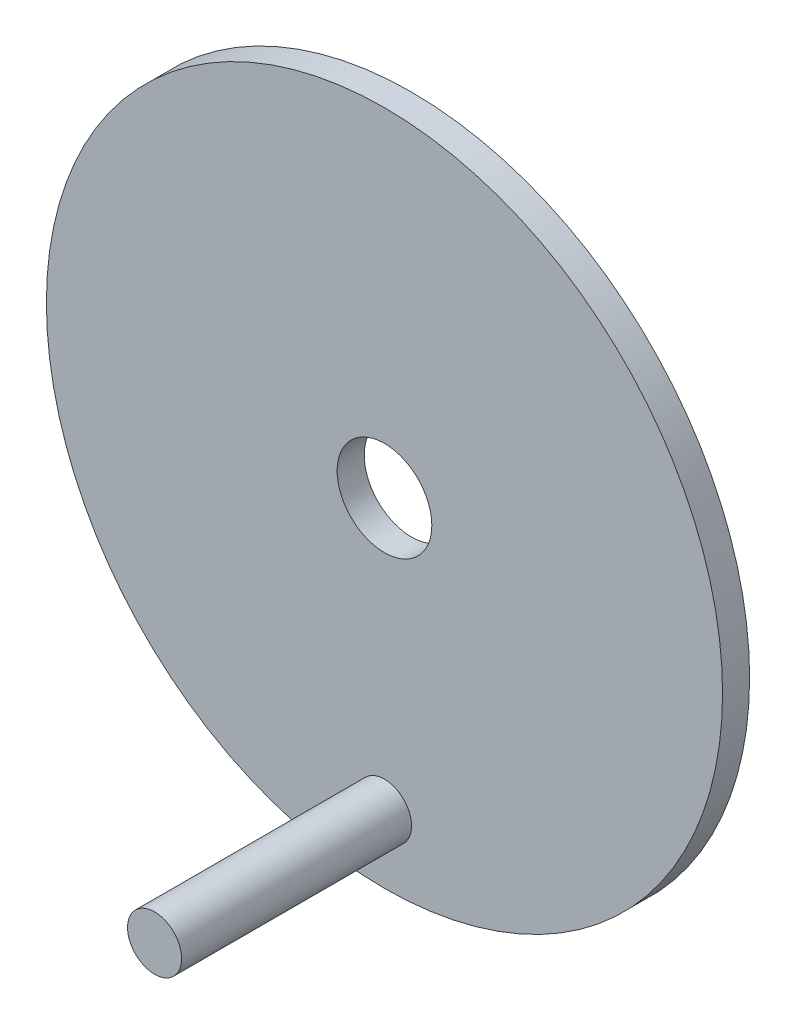
ISO-10303-21;
HEADER;
FILE_DESCRIPTION(('STEP AP214'),'2;1');
FILE_NAME('part.step','',(''),(''),'','','');
FILE_SCHEMA(('AUTOMOTIVE_DESIGN { 1 0 10303 214 1 1 1 1 }'));
ENDSEC;
DATA;
#1=APPLICATION_CONTEXT('core data for automotive mechanical design processes');
#2=APPLICATION_PROTOCOL_DEFINITION('international standard','automotive_design',2000,#1);
#3=PRODUCT_CONTEXT('',#1,'mechanical');
#4=PRODUCT('Part','Part','',(#3));
#5=PRODUCT_RELATED_PRODUCT_CATEGORY('part','',(#4));
#6=PRODUCT_DEFINITION_FORMATION('','',#4);
#7=PRODUCT_DEFINITION_CONTEXT('part definition',#1,'design');
#8=PRODUCT_DEFINITION('design','',#6,#7);
#9=PRODUCT_DEFINITION_SHAPE('','',#8);
#10=(LENGTH_UNIT() NAMED_UNIT(*) SI_UNIT(.MILLI.,.METRE.));
#11=(NAMED_UNIT(*) PLANE_ANGLE_UNIT() SI_UNIT($,.RADIAN.));
#12=(NAMED_UNIT(*) SI_UNIT($,.STERADIAN.) SOLID_ANGLE_UNIT());
#13=UNCERTAINTY_MEASURE_WITH_UNIT(LENGTH_MEASURE(1.E-05),#10,'distance_accuracy_value','');
#14=(GEOMETRIC_REPRESENTATION_CONTEXT(3) GLOBAL_UNCERTAINTY_ASSIGNED_CONTEXT((#13)) GLOBAL_UNIT_ASSIGNED_CONTEXT((#10,
#11,#12)) REPRESENTATION_CONTEXT('',''));
#15=CARTESIAN_POINT('',(0.,0.,0.));
#16=DIRECTION('',(0.,0.,1.));
#17=DIRECTION('',(1.,0.,0.));
#18=AXIS2_PLACEMENT_3D('',#15,#16,#17);
#19=CARTESIAN_POINT('',(0.,0.,20.));
#20=DIRECTION('',(0.,0.,1.));
#21=DIRECTION('',(1.,0.,0.));
#22=AXIS2_PLACEMENT_3D('',#19,#20,#21);
#23=PLANE('',#22);
#24=CARTESIAN_POINT('',(0.,-200.,20.));
#25=DIRECTION('',(0.,0.,1.));
#26=DIRECTION('',(1.,0.,0.));
#27=AXIS2_PLACEMENT_3D('',#24,#25,#26);
#28=CIRCLE('',#27,20.);
#29=CARTESIAN_POINT('',(20.,-200.,20.));
#30=VERTEX_POINT('',#29);
#31=EDGE_CURVE('E49',#30,#30,#28,.T.);
#32=ORIENTED_EDGE('',*,*,#31,.F.);
#33=EDGE_LOOP('',(#32));
#34=FACE_BOUND('',#33,.T.);
#35=CARTESIAN_POINT('',(0.,0.,20.));
#36=DIRECTION('',(0.,0.,1.));
#37=DIRECTION('',(1.,0.,0.));
#38=AXIS2_PLACEMENT_3D('',#35,#36,#37);
#39=CIRCLE('',#38,250.);
#40=CARTESIAN_POINT('',(250.,0.,20.));
#41=VERTEX_POINT('',#40);
#42=EDGE_CURVE('E10',#41,#41,#39,.T.);
#43=ORIENTED_EDGE('',*,*,#42,.T.);
#44=EDGE_LOOP('',(#43));
#45=FACE_BOUND('',#44,.T.);
#46=CARTESIAN_POINT('',(0.,0.,20.));
#47=DIRECTION('',(0.,0.,1.));
#48=DIRECTION('',(1.,0.,0.));
#49=AXIS2_PLACEMENT_3D('',#46,#47,#48);
#50=CIRCLE('',#49,35.);
#51=CARTESIAN_POINT('',(35.,0.,20.));
#52=VERTEX_POINT('',#51);
#53=EDGE_CURVE('E41',#52,#52,#50,.T.);
#54=ORIENTED_EDGE('',*,*,#53,.F.);
#55=EDGE_LOOP('',(#54));
#56=FACE_BOUND('',#55,.T.);
#57=ADVANCED_FACE('F30',(#34,#45,#56),#23,.T.);
#58=CARTESIAN_POINT('',(0.,0.,0.));
#59=DIRECTION('',(0.,0.,1.));
#60=DIRECTION('',(1.,0.,0.));
#61=AXIS2_PLACEMENT_3D('',#58,#59,#60);
#62=PLANE('',#61);
#63=CARTESIAN_POINT('',(0.,0.,0.));
#64=DIRECTION('',(0.,0.,1.));
#65=DIRECTION('',(1.,0.,0.));
#66=AXIS2_PLACEMENT_3D('',#63,#64,#65);
#67=CIRCLE('',#66,250.);
#68=CARTESIAN_POINT('',(250.,0.,0.));
#69=VERTEX_POINT('',#68);
#70=EDGE_CURVE('E34',#69,#69,#67,.T.);
#71=ORIENTED_EDGE('',*,*,#70,.F.);
#72=EDGE_LOOP('',(#71));
#73=FACE_BOUND('',#72,.T.);
#74=CARTESIAN_POINT('',(0.,0.,0.));
#75=DIRECTION('',(0.,0.,1.));
#76=DIRECTION('',(1.,0.,0.));
#77=AXIS2_PLACEMENT_3D('',#74,#75,#76);
#78=CIRCLE('',#77,35.);
#79=CARTESIAN_POINT('',(35.,0.,0.));
#80=VERTEX_POINT('',#79);
#81=EDGE_CURVE('E43',#80,#80,#78,.T.);
#82=ORIENTED_EDGE('',*,*,#81,.T.);
#83=EDGE_LOOP('',(#82));
#84=FACE_BOUND('',#83,.T.);
#85=ADVANCED_FACE('F65',(#73,#84),#62,.F.);
#86=CARTESIAN_POINT('',(0.,0.,20.));
#87=DIRECTION('',(0.,0.,-1.));
#88=DIRECTION('',(-1.,0.,0.));
#89=AXIS2_PLACEMENT_3D('',#86,#87,#88);
#90=CYLINDRICAL_SURFACE('',#89,250.);
#91=ORIENTED_EDGE('',*,*,#42,.F.);
#92=EDGE_LOOP('',(#91));
#93=FACE_BOUND('',#92,.T.);
#94=ORIENTED_EDGE('',*,*,#70,.T.);
#95=EDGE_LOOP('',(#94));
#96=FACE_BOUND('',#95,.T.);
#97=ADVANCED_FACE('F32',(#93,#96),#90,.T.);
#98=CARTESIAN_POINT('',(0.,0.,20.));
#99=DIRECTION('',(0.,0.,-1.));
#100=DIRECTION('',(-1.,0.,0.));
#101=AXIS2_PLACEMENT_3D('',#98,#99,#100);
#102=CYLINDRICAL_SURFACE('',#101,35.);
#103=ORIENTED_EDGE('',*,*,#53,.T.);
#104=EDGE_LOOP('',(#103));
#105=FACE_BOUND('',#104,.T.);
#106=ORIENTED_EDGE('',*,*,#81,.F.);
#107=EDGE_LOOP('',(#106));
#108=FACE_BOUND('',#107,.T.);
#109=ADVANCED_FACE('F60',(#105,#108),#102,.F.);
#110=CARTESIAN_POINT('',(0.,-200.,190.));
#111=DIRECTION('',(0.,0.,-1.));
#112=DIRECTION('',(-1.,0.,0.));
#113=AXIS2_PLACEMENT_3D('',#110,#111,#112);
#114=CYLINDRICAL_SURFACE('',#113,20.);
#115=CARTESIAN_POINT('',(0.,-200.,190.));
#116=DIRECTION('',(0.,0.,1.));
#117=DIRECTION('',(1.,0.,0.));
#118=AXIS2_PLACEMENT_3D('',#115,#116,#117);
#119=CIRCLE('',#118,20.);
#120=CARTESIAN_POINT('',(20.,-200.,190.));
#121=VERTEX_POINT('',#120);
#122=EDGE_CURVE('E46',#121,#121,#119,.T.);
#123=ORIENTED_EDGE('',*,*,#122,.F.);
#124=EDGE_LOOP('',(#123));
#125=FACE_BOUND('',#124,.T.);
#126=ORIENTED_EDGE('',*,*,#31,.T.);
#127=EDGE_LOOP('',(#126));
#128=FACE_BOUND('',#127,.T.);
#129=ADVANCED_FACE('F57',(#125,#128),#114,.T.);
#130=CARTESIAN_POINT('',(0.,-200.,190.));
#131=DIRECTION('',(0.,0.,1.));
#132=DIRECTION('',(1.,0.,0.));
#133=AXIS2_PLACEMENT_3D('',#130,#131,#132);
#134=PLANE('',#133);
#135=ORIENTED_EDGE('',*,*,#122,.T.);
#136=EDGE_LOOP('',(#135));
#137=FACE_BOUND('',#136,.T.);
#138=ADVANCED_FACE('F55',(#137),#134,.T.);
#139=CLOSED_SHELL('',(#57,#85,#97,#109,#129,#138));
#140=MANIFOLD_SOLID_BREP('B2',#139);
#141=ADVANCED_BREP_SHAPE_REPRESENTATION('',(#18,#140),#14);
#142=SHAPE_DEFINITION_REPRESENTATION(#9,#141);
ENDSEC;
END-ISO-10303-21;
